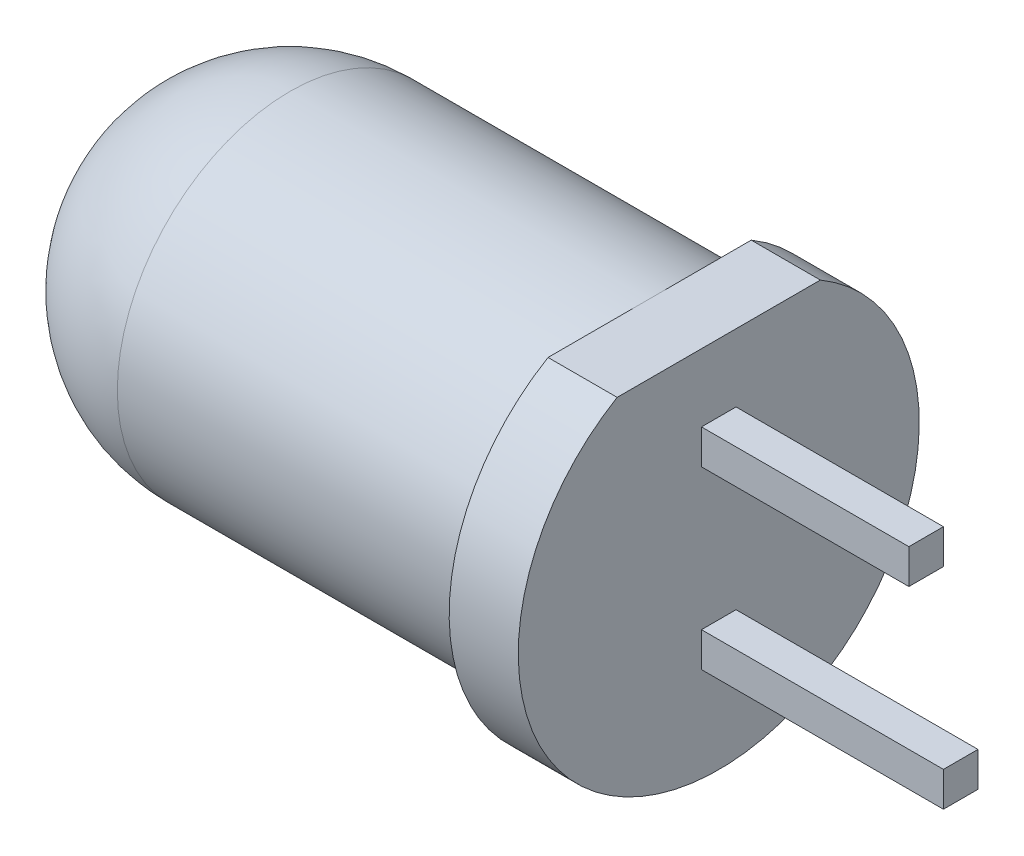
ISO-10303-21;
HEADER;
FILE_DESCRIPTION(('STEP AP214'),'2;1');
FILE_NAME('part.step','',(''),(''),'','','');
FILE_SCHEMA(('AUTOMOTIVE_DESIGN { 1 0 10303 214 1 1 1 1 }'));
ENDSEC;
DATA;
#1=APPLICATION_CONTEXT('core data for automotive mechanical design processes');
#2=APPLICATION_PROTOCOL_DEFINITION('international standard','automotive_design',2000,#1);
#3=PRODUCT_CONTEXT('',#1,'mechanical');
#4=PRODUCT('Part','Part','',(#3));
#5=PRODUCT_RELATED_PRODUCT_CATEGORY('part','',(#4));
#6=PRODUCT_DEFINITION_FORMATION('','',#4);
#7=PRODUCT_DEFINITION_CONTEXT('part definition',#1,'design');
#8=PRODUCT_DEFINITION('design','',#6,#7);
#9=PRODUCT_DEFINITION_SHAPE('','',#8);
#10=(LENGTH_UNIT() NAMED_UNIT(*) SI_UNIT(.MILLI.,.METRE.));
#11=(NAMED_UNIT(*) PLANE_ANGLE_UNIT() SI_UNIT($,.RADIAN.));
#12=(NAMED_UNIT(*) SI_UNIT($,.STERADIAN.) SOLID_ANGLE_UNIT());
#13=UNCERTAINTY_MEASURE_WITH_UNIT(LENGTH_MEASURE(1.E-05),#10,'distance_accuracy_value','');
#14=(GEOMETRIC_REPRESENTATION_CONTEXT(3) GLOBAL_UNCERTAINTY_ASSIGNED_CONTEXT((#13)) GLOBAL_UNIT_ASSIGNED_CONTEXT((#10,
#11,#12)) REPRESENTATION_CONTEXT('',''));
#15=CARTESIAN_POINT('',(0.,0.,0.));
#16=DIRECTION('',(0.,0.,1.));
#17=DIRECTION('',(1.,0.,0.));
#18=AXIS2_PLACEMENT_3D('',#15,#16,#17);
#19=CARTESIAN_POINT('',(5.2,2.5,0.));
#20=DIRECTION('',(1.,0.,0.));
#21=DIRECTION('',(0.,0.,-1.));
#22=AXIS2_PLACEMENT_3D('',#19,#20,#21);
#23=PLANE('',#22);
#24=CARTESIAN_POINT('',(5.2,0.,0.));
#25=DIRECTION('',(-1.,0.,0.));
#26=DIRECTION('',(0.,0.,1.));
#27=AXIS2_PLACEMENT_3D('',#24,#25,#26);
#28=CIRCLE('',#27,2.9);
#29=CARTESIAN_POINT('',(5.2,2.5,-1.46969384566991));
#30=VERTEX_POINT('',#29);
#31=CARTESIAN_POINT('',(5.2,2.5,1.46969384566991));
#32=VERTEX_POINT('',#31);
#33=EDGE_CURVE('E196',#30,#32,#28,.T.);
#34=ORIENTED_EDGE('',*,*,#33,.T.);
#35=DIRECTION('',(0.,0.,1.));
#36=VECTOR('',#35,1.);
#37=CARTESIAN_POINT('',(5.2,2.5,1.46969384566991));
#38=LINE('',#37,#36);
#39=CARTESIAN_POINT('',(5.2,2.5,0.));
#40=VERTEX_POINT('',#39);
#41=EDGE_CURVE('E192',#40,#32,#38,.T.);
#42=ORIENTED_EDGE('',*,*,#41,.F.);
#43=CARTESIAN_POINT('',(5.2,0.,0.));
#44=DIRECTION('',(-1.,0.,0.));
#45=DIRECTION('',(0.,0.,1.));
#46=AXIS2_PLACEMENT_3D('',#43,#44,#45);
#47=CIRCLE('',#46,2.5);
#48=EDGE_CURVE('E11',#40,#40,#47,.T.);
#49=ORIENTED_EDGE('',*,*,#48,.F.);
#50=EDGE_CURVE('E194',#30,#40,#38,.T.);
#51=ORIENTED_EDGE('',*,*,#50,.F.);
#52=EDGE_LOOP('',(#34,#42,#49,#51));
#53=FACE_BOUND('',#52,.T.);
#54=ADVANCED_FACE('F39',(#53),#23,.F.);
#55=CARTESIAN_POINT('',(-3.10468571490483,0.,0.));
#56=DIRECTION('',(-1.,0.,0.));
#57=DIRECTION('',(0.,0.,1.));
#58=AXIS2_PLACEMENT_3D('',#55,#56,#57);
#59=CYLINDRICAL_SURFACE('',#58,2.5);
#60=CARTESIAN_POINT('',(0.,0.,0.));
#61=DIRECTION('',(-1.,0.,0.));
#62=DIRECTION('',(0.,0.,1.));
#63=AXIS2_PLACEMENT_3D('',#60,#61,#62);
#64=CIRCLE('',#63,2.5);
#65=CARTESIAN_POINT('',(0.,0.,2.5));
#66=VERTEX_POINT('',#65);
#67=EDGE_CURVE('E46',#66,#66,#64,.T.);
#68=ORIENTED_EDGE('',*,*,#67,.F.);
#69=EDGE_LOOP('',(#68));
#70=FACE_BOUND('',#69,.T.);
#71=ORIENTED_EDGE('',*,*,#48,.T.);
#72=EDGE_LOOP('',(#71));
#73=FACE_BOUND('',#72,.T.);
#74=ADVANCED_FACE('F206',(#70,#73),#59,.T.);
#75=CARTESIAN_POINT('',(0.,0.,0.));
#76=DIRECTION('',(-1.,0.,0.));
#77=DIRECTION('',(0.,1.,0.));
#78=AXIS2_PLACEMENT_3D('',#75,#76,#77);
#79=SPHERICAL_SURFACE('',#78,2.5);
#80=ORIENTED_EDGE('',*,*,#67,.T.);
#81=EDGE_LOOP('',(#80));
#82=FACE_BOUND('',#81,.T.);
#83=ADVANCED_FACE('F204',(#82),#79,.T.);
#84=CARTESIAN_POINT('',(6.2,2.9,0.));
#85=DIRECTION('',(-1.,0.,0.));
#86=DIRECTION('',(0.,0.,1.));
#87=AXIS2_PLACEMENT_3D('',#84,#85,#86);
#88=PLANE('',#87);
#89=DIRECTION('',(0.,0.,-1.));
#90=VECTOR('',#89,1.);
#91=CARTESIAN_POINT('',(6.2,1.52,0.));
#92=LINE('',#91,#90);
#93=CARTESIAN_POINT('',(6.2,1.52,0.25));
#94=VERTEX_POINT('',#93);
#95=CARTESIAN_POINT('',(6.2,1.52,-0.25));
#96=VERTEX_POINT('',#95);
#97=EDGE_CURVE('E53',#94,#96,#92,.T.);
#98=ORIENTED_EDGE('',*,*,#97,.T.);
#99=DIRECTION('',(0.,-1.,0.));
#100=VECTOR('',#99,1.);
#101=CARTESIAN_POINT('',(6.2,0.,-0.25));
#102=LINE('',#101,#100);
#103=CARTESIAN_POINT('',(6.2,1.02,-0.25));
#104=VERTEX_POINT('',#103);
#105=EDGE_CURVE('E122',#96,#104,#102,.T.);
#106=ORIENTED_EDGE('',*,*,#105,.T.);
#107=DIRECTION('',(0.,0.,-1.));
#108=VECTOR('',#107,1.);
#109=CARTESIAN_POINT('',(6.2,1.02,0.));
#110=LINE('',#109,#108);
#111=CARTESIAN_POINT('',(6.2,1.02,0.25));
#112=VERTEX_POINT('',#111);
#113=EDGE_CURVE('E135',#112,#104,#110,.T.);
#114=ORIENTED_EDGE('',*,*,#113,.F.);
#115=DIRECTION('',(0.,-1.,0.));
#116=VECTOR('',#115,1.);
#117=CARTESIAN_POINT('',(6.2,0.,0.25));
#118=LINE('',#117,#116);
#119=EDGE_CURVE('E58',#94,#112,#118,.T.);
#120=ORIENTED_EDGE('',*,*,#119,.F.);
#121=EDGE_LOOP('',(#98,#106,#114,#120));
#122=FACE_BOUND('',#121,.T.);
#123=DIRECTION('',(0.,1.,0.));
#124=VECTOR('',#123,1.);
#125=CARTESIAN_POINT('',(6.2,0.,0.250000000000002));
#126=LINE('',#125,#124);
#127=CARTESIAN_POINT('',(6.2,-1.52,0.249999999999999));
#128=VERTEX_POINT('',#127);
#129=CARTESIAN_POINT('',(6.2,-1.02,0.25));
#130=VERTEX_POINT('',#129);
#131=EDGE_CURVE('E168',#128,#130,#126,.T.);
#132=ORIENTED_EDGE('',*,*,#131,.T.);
#133=DIRECTION('',(0.,0.,-1.));
#134=VECTOR('',#133,1.);
#135=CARTESIAN_POINT('',(6.2,-1.02,0.));
#136=LINE('',#135,#134);
#137=CARTESIAN_POINT('',(6.2,-1.02,-0.25));
#138=VERTEX_POINT('',#137);
#139=EDGE_CURVE('E125',#130,#138,#136,.T.);
#140=ORIENTED_EDGE('',*,*,#139,.T.);
#141=DIRECTION('',(0.,1.,0.));
#142=VECTOR('',#141,1.);
#143=CARTESIAN_POINT('',(6.2,0.,-0.25));
#144=LINE('',#143,#142);
#145=CARTESIAN_POINT('',(6.2,-1.52,-0.25));
#146=VERTEX_POINT('',#145);
#147=EDGE_CURVE('E159',#146,#138,#144,.T.);
#148=ORIENTED_EDGE('',*,*,#147,.F.);
#149=DIRECTION('',(0.,0.,-1.));
#150=VECTOR('',#149,1.);
#151=CARTESIAN_POINT('',(6.2,-1.52,0.));
#152=LINE('',#151,#150);
#153=EDGE_CURVE('E170',#128,#146,#152,.T.);
#154=ORIENTED_EDGE('',*,*,#153,.F.);
#155=EDGE_LOOP('',(#132,#140,#148,#154));
#156=FACE_BOUND('',#155,.T.);
#157=CARTESIAN_POINT('',(6.2,0.,0.));
#158=DIRECTION('',(-1.,0.,0.));
#159=DIRECTION('',(0.,0.,1.));
#160=AXIS2_PLACEMENT_3D('',#157,#158,#159);
#161=CIRCLE('',#160,2.9);
#162=CARTESIAN_POINT('',(6.2,2.5,-1.46969384566991));
#163=VERTEX_POINT('',#162);
#164=CARTESIAN_POINT('',(6.2,2.5,1.46969384566991));
#165=VERTEX_POINT('',#164);
#166=EDGE_CURVE('E199',#163,#165,#161,.T.);
#167=ORIENTED_EDGE('',*,*,#166,.F.);
#168=DIRECTION('',(0.,0.,-1.));
#169=VECTOR('',#168,1.);
#170=CARTESIAN_POINT('',(6.2,2.5,1.46969384566991));
#171=LINE('',#170,#169);
#172=EDGE_CURVE('E186',#165,#163,#171,.T.);
#173=ORIENTED_EDGE('',*,*,#172,.F.);
#174=EDGE_LOOP('',(#167,#173));
#175=FACE_BOUND('',#174,.T.);
#176=ADVANCED_FACE('F222',(#122,#156,#175),#88,.F.);
#177=CARTESIAN_POINT('',(-3.10468571490483,0.,0.));
#178=DIRECTION('',(-1.,0.,0.));
#179=DIRECTION('',(0.,0.,1.));
#180=AXIS2_PLACEMENT_3D('',#177,#178,#179);
#181=CYLINDRICAL_SURFACE('',#180,2.9);
#182=ORIENTED_EDGE('',*,*,#166,.T.);
#183=DIRECTION('',(1.,0.,0.));
#184=VECTOR('',#183,1.);
#185=CARTESIAN_POINT('',(-2.501,2.5,1.46969384566991));
#186=LINE('',#185,#184);
#187=EDGE_CURVE('E188',#32,#165,#186,.T.);
#188=ORIENTED_EDGE('',*,*,#187,.F.);
#189=ORIENTED_EDGE('',*,*,#33,.F.);
#190=DIRECTION('',(1.,0.,0.));
#191=VECTOR('',#190,1.);
#192=CARTESIAN_POINT('',(-2.501,2.5,-1.46969384566991));
#193=LINE('',#192,#191);
#194=EDGE_CURVE('E189',#30,#163,#193,.T.);
#195=ORIENTED_EDGE('',*,*,#194,.T.);
#196=EDGE_LOOP('',(#182,#188,#189,#195));
#197=FACE_BOUND('',#196,.T.);
#198=ADVANCED_FACE('F219',(#197),#181,.T.);
#199=CARTESIAN_POINT('',(-2.501,2.5,1.46969384566991));
#200=DIRECTION('',(0.,-1.,0.));
#201=DIRECTION('',(0.,0.,-1.));
#202=AXIS2_PLACEMENT_3D('',#199,#200,#201);
#203=PLANE('',#202);
#204=ORIENTED_EDGE('',*,*,#50,.T.);
#205=ORIENTED_EDGE('',*,*,#41,.T.);
#206=ORIENTED_EDGE('',*,*,#187,.T.);
#207=ORIENTED_EDGE('',*,*,#172,.T.);
#208=ORIENTED_EDGE('',*,*,#194,.F.);
#209=EDGE_LOOP('',(#204,#205,#206,#207,#208));
#210=FACE_BOUND('',#209,.T.);
#211=ADVANCED_FACE('F216',(#210),#203,.F.);
#212=CARTESIAN_POINT('',(9.7,-1.02,0.));
#213=DIRECTION('',(0.,1.,0.));
#214=DIRECTION('',(0.,0.,1.));
#215=AXIS2_PLACEMENT_3D('',#212,#213,#214);
#216=PLANE('',#215);
#217=ORIENTED_EDGE('',*,*,#139,.F.);
#218=DIRECTION('',(-1.,0.,0.));
#219=VECTOR('',#218,1.);
#220=CARTESIAN_POINT('',(9.7,-1.02,0.25));
#221=LINE('',#220,#219);
#222=CARTESIAN_POINT('',(9.7,-1.02,0.25));
#223=VERTEX_POINT('',#222);
#224=EDGE_CURVE('E183',#223,#130,#221,.T.);
#225=ORIENTED_EDGE('',*,*,#224,.F.);
#226=DIRECTION('',(0.,0.,-1.));
#227=VECTOR('',#226,1.);
#228=CARTESIAN_POINT('',(9.7,-1.02,0.));
#229=LINE('',#228,#227);
#230=CARTESIAN_POINT('',(9.7,-1.02,-0.25));
#231=VERTEX_POINT('',#230);
#232=EDGE_CURVE('E155',#223,#231,#229,.T.);
#233=ORIENTED_EDGE('',*,*,#232,.T.);
#234=DIRECTION('',(-1.,0.,0.));
#235=VECTOR('',#234,1.);
#236=CARTESIAN_POINT('',(9.7,-1.02,-0.25));
#237=LINE('',#236,#235);
#238=EDGE_CURVE('E166',#231,#138,#237,.T.);
#239=ORIENTED_EDGE('',*,*,#238,.T.);
#240=EDGE_LOOP('',(#217,#225,#233,#239));
#241=FACE_BOUND('',#240,.T.);
#242=ADVANCED_FACE('F271',(#241),#216,.T.);
#243=CARTESIAN_POINT('',(9.7,0.,0.250000000000002));
#244=DIRECTION('',(0.,0.,1.));
#245=DIRECTION('',(0.,-1.,0.));
#246=AXIS2_PLACEMENT_3D('',#243,#244,#245);
#247=PLANE('',#246);
#248=ORIENTED_EDGE('',*,*,#131,.F.);
#249=DIRECTION('',(-1.,0.,0.));
#250=VECTOR('',#249,1.);
#251=CARTESIAN_POINT('',(9.7,-1.52,0.249999999999999));
#252=LINE('',#251,#250);
#253=CARTESIAN_POINT('',(9.7,-1.52,0.249999999999999));
#254=VERTEX_POINT('',#253);
#255=EDGE_CURVE('E180',#254,#128,#252,.T.);
#256=ORIENTED_EDGE('',*,*,#255,.F.);
#257=DIRECTION('',(0.,1.,0.));
#258=VECTOR('',#257,1.);
#259=CARTESIAN_POINT('',(9.7,0.,0.250000000000002));
#260=LINE('',#259,#258);
#261=EDGE_CURVE('E158',#254,#223,#260,.T.);
#262=ORIENTED_EDGE('',*,*,#261,.T.);
#263=ORIENTED_EDGE('',*,*,#224,.T.);
#264=EDGE_LOOP('',(#248,#256,#262,#263));
#265=FACE_BOUND('',#264,.T.);
#266=ADVANCED_FACE('F279',(#265),#247,.T.);
#267=CARTESIAN_POINT('',(9.7,-1.52,0.));
#268=DIRECTION('',(0.,1.,0.));
#269=DIRECTION('',(0.,0.,1.));
#270=AXIS2_PLACEMENT_3D('',#267,#268,#269);
#271=PLANE('',#270);
#272=ORIENTED_EDGE('',*,*,#153,.T.);
#273=DIRECTION('',(-1.,0.,0.));
#274=VECTOR('',#273,1.);
#275=CARTESIAN_POINT('',(9.7,-1.52,-0.25));
#276=LINE('',#275,#274);
#277=CARTESIAN_POINT('',(9.7,-1.52,-0.25));
#278=VERTEX_POINT('',#277);
#279=EDGE_CURVE('E177',#278,#146,#276,.T.);
#280=ORIENTED_EDGE('',*,*,#279,.F.);
#281=DIRECTION('',(0.,0.,-1.));
#282=VECTOR('',#281,1.);
#283=CARTESIAN_POINT('',(9.7,-1.52,0.));
#284=LINE('',#283,#282);
#285=EDGE_CURVE('E162',#254,#278,#284,.T.);
#286=ORIENTED_EDGE('',*,*,#285,.F.);
#287=ORIENTED_EDGE('',*,*,#255,.T.);
#288=EDGE_LOOP('',(#272,#280,#286,#287));
#289=FACE_BOUND('',#288,.T.);
#290=ADVANCED_FACE('F288',(#289),#271,.F.);
#291=CARTESIAN_POINT('',(9.7,0.,-0.25));
#292=DIRECTION('',(0.,0.,1.));
#293=DIRECTION('',(1.,0.,0.));
#294=AXIS2_PLACEMENT_3D('',#291,#292,#293);
#295=PLANE('',#294);
#296=ORIENTED_EDGE('',*,*,#147,.T.);
#297=ORIENTED_EDGE('',*,*,#238,.F.);
#298=DIRECTION('',(0.,1.,0.));
#299=VECTOR('',#298,1.);
#300=CARTESIAN_POINT('',(9.7,0.,-0.25));
#301=LINE('',#300,#299);
#302=EDGE_CURVE('E164',#278,#231,#301,.T.);
#303=ORIENTED_EDGE('',*,*,#302,.F.);
#304=ORIENTED_EDGE('',*,*,#279,.T.);
#305=EDGE_LOOP('',(#296,#297,#303,#304));
#306=FACE_BOUND('',#305,.T.);
#307=ADVANCED_FACE('F297',(#306),#295,.F.);
#308=CARTESIAN_POINT('',(9.7,0.,0.));
#309=DIRECTION('',(1.,0.,0.));
#310=DIRECTION('',(0.,0.,-1.));
#311=AXIS2_PLACEMENT_3D('',#308,#309,#310);
#312=PLANE('',#311);
#313=ORIENTED_EDGE('',*,*,#232,.F.);
#314=ORIENTED_EDGE('',*,*,#261,.F.);
#315=ORIENTED_EDGE('',*,*,#285,.T.);
#316=ORIENTED_EDGE('',*,*,#302,.T.);
#317=EDGE_LOOP('',(#313,#314,#315,#316));
#318=FACE_BOUND('',#317,.T.);
#319=ADVANCED_FACE('F306',(#318),#312,.T.);
#320=CARTESIAN_POINT('',(9.2,0.,-0.25));
#321=DIRECTION('',(0.,0.,-1.));
#322=DIRECTION('',(-1.,0.,0.));
#323=AXIS2_PLACEMENT_3D('',#320,#321,#322);
#324=PLANE('',#323);
#325=ORIENTED_EDGE('',*,*,#105,.F.);
#326=DIRECTION('',(-1.,0.,0.));
#327=VECTOR('',#326,1.);
#328=CARTESIAN_POINT('',(9.2,1.52,-0.25));
#329=LINE('',#328,#327);
#330=CARTESIAN_POINT('',(9.2,1.52,-0.25));
#331=VERTEX_POINT('',#330);
#332=EDGE_CURVE('E117',#331,#96,#329,.T.);
#333=ORIENTED_EDGE('',*,*,#332,.F.);
#334=DIRECTION('',(0.,-1.,0.));
#335=VECTOR('',#334,1.);
#336=CARTESIAN_POINT('',(9.2,0.,-0.25));
#337=LINE('',#336,#335);
#338=CARTESIAN_POINT('',(9.2,1.02,-0.25));
#339=VERTEX_POINT('',#338);
#340=EDGE_CURVE('E121',#331,#339,#337,.T.);
#341=ORIENTED_EDGE('',*,*,#340,.T.);
#342=DIRECTION('',(-1.,0.,0.));
#343=VECTOR('',#342,1.);
#344=CARTESIAN_POINT('',(9.2,1.02,-0.25));
#345=LINE('',#344,#343);
#346=EDGE_CURVE('E144',#339,#104,#345,.T.);
#347=ORIENTED_EDGE('',*,*,#346,.T.);
#348=EDGE_LOOP('',(#325,#333,#341,#347));
#349=FACE_BOUND('',#348,.T.);
#350=ADVANCED_FACE('F119',(#349),#324,.T.);
#351=CARTESIAN_POINT('',(9.2,1.52,0.));
#352=DIRECTION('',(0.,1.,0.));
#353=DIRECTION('',(0.,0.,1.));
#354=AXIS2_PLACEMENT_3D('',#351,#352,#353);
#355=PLANE('',#354);
#356=ORIENTED_EDGE('',*,*,#97,.F.);
#357=DIRECTION('',(-1.,0.,0.));
#358=VECTOR('',#357,1.);
#359=CARTESIAN_POINT('',(9.2,1.52,0.25));
#360=LINE('',#359,#358);
#361=CARTESIAN_POINT('',(9.2,1.52,0.25));
#362=VERTEX_POINT('',#361);
#363=EDGE_CURVE('E126',#362,#94,#360,.T.);
#364=ORIENTED_EDGE('',*,*,#363,.F.);
#365=DIRECTION('',(0.,0.,-1.));
#366=VECTOR('',#365,1.);
#367=CARTESIAN_POINT('',(9.2,1.52,0.));
#368=LINE('',#367,#366);
#369=EDGE_CURVE('E131',#362,#331,#368,.T.);
#370=ORIENTED_EDGE('',*,*,#369,.T.);
#371=ORIENTED_EDGE('',*,*,#332,.T.);
#372=EDGE_LOOP('',(#356,#364,#370,#371));
#373=FACE_BOUND('',#372,.T.);
#374=ADVANCED_FACE('F137',(#373),#355,.T.);
#375=CARTESIAN_POINT('',(9.2,0.,0.25));
#376=DIRECTION('',(0.,0.,-1.));
#377=DIRECTION('',(-1.,0.,0.));
#378=AXIS2_PLACEMENT_3D('',#375,#376,#377);
#379=PLANE('',#378);
#380=ORIENTED_EDGE('',*,*,#119,.T.);
#381=DIRECTION('',(-1.,0.,0.));
#382=VECTOR('',#381,1.);
#383=CARTESIAN_POINT('',(9.2,1.02,0.25));
#384=LINE('',#383,#382);
#385=CARTESIAN_POINT('',(9.2,1.02,0.25));
#386=VERTEX_POINT('',#385);
#387=EDGE_CURVE('E151',#386,#112,#384,.T.);
#388=ORIENTED_EDGE('',*,*,#387,.F.);
#389=DIRECTION('',(0.,-1.,0.));
#390=VECTOR('',#389,1.);
#391=CARTESIAN_POINT('',(9.2,0.,0.25));
#392=LINE('',#391,#390);
#393=EDGE_CURVE('E139',#362,#386,#392,.T.);
#394=ORIENTED_EDGE('',*,*,#393,.F.);
#395=ORIENTED_EDGE('',*,*,#363,.T.);
#396=EDGE_LOOP('',(#380,#388,#394,#395));
#397=FACE_BOUND('',#396,.T.);
#398=ADVANCED_FACE('F328',(#397),#379,.F.);
#399=CARTESIAN_POINT('',(9.2,1.02,0.));
#400=DIRECTION('',(0.,1.,0.));
#401=DIRECTION('',(0.,0.,1.));
#402=AXIS2_PLACEMENT_3D('',#399,#400,#401);
#403=PLANE('',#402);
#404=ORIENTED_EDGE('',*,*,#113,.T.);
#405=ORIENTED_EDGE('',*,*,#346,.F.);
#406=DIRECTION('',(0.,0.,-1.));
#407=VECTOR('',#406,1.);
#408=CARTESIAN_POINT('',(9.2,1.02,0.));
#409=LINE('',#408,#407);
#410=EDGE_CURVE('E133',#386,#339,#409,.T.);
#411=ORIENTED_EDGE('',*,*,#410,.F.);
#412=ORIENTED_EDGE('',*,*,#387,.T.);
#413=EDGE_LOOP('',(#404,#405,#411,#412));
#414=FACE_BOUND('',#413,.T.);
#415=ADVANCED_FACE('F336',(#414),#403,.F.);
#416=CARTESIAN_POINT('',(9.2,0.,0.));
#417=DIRECTION('',(1.,0.,0.));
#418=DIRECTION('',(0.,0.,-1.));
#419=AXIS2_PLACEMENT_3D('',#416,#417,#418);
#420=PLANE('',#419);
#421=ORIENTED_EDGE('',*,*,#340,.F.);
#422=ORIENTED_EDGE('',*,*,#369,.F.);
#423=ORIENTED_EDGE('',*,*,#393,.T.);
#424=ORIENTED_EDGE('',*,*,#410,.T.);
#425=EDGE_LOOP('',(#421,#422,#423,#424));
#426=FACE_BOUND('',#425,.T.);
#427=ADVANCED_FACE('F130',(#426),#420,.T.);
#428=CLOSED_SHELL('',(#54,#74,#83,#176,#198,#211,#242,#266,#290,#307,#319,#350,#374,#398,#415,#427));
#429=MANIFOLD_SOLID_BREP('B2',#428);
#430=ADVANCED_BREP_SHAPE_REPRESENTATION('',(#18,#429),#14);
#431=SHAPE_DEFINITION_REPRESENTATION(#9,#430);
ENDSEC;
END-ISO-10303-21;
